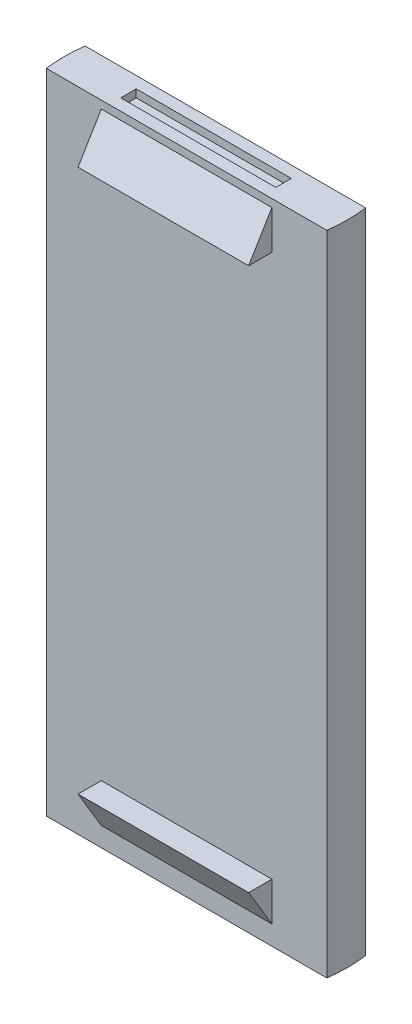
ISO-10303-21;
HEADER;
FILE_DESCRIPTION(('STEP AP214'),'2;1');
FILE_NAME('part.step','',(''),(''),'','','');
FILE_SCHEMA(('AUTOMOTIVE_DESIGN { 1 0 10303 214 1 1 1 1 }'));
ENDSEC;
DATA;
#1=APPLICATION_CONTEXT('core data for automotive mechanical design processes');
#2=APPLICATION_PROTOCOL_DEFINITION('international standard','automotive_design',2000,#1);
#3=PRODUCT_CONTEXT('',#1,'mechanical');
#4=PRODUCT('Part','Part','',(#3));
#5=PRODUCT_RELATED_PRODUCT_CATEGORY('part','',(#4));
#6=PRODUCT_DEFINITION_FORMATION('','',#4);
#7=PRODUCT_DEFINITION_CONTEXT('part definition',#1,'design');
#8=PRODUCT_DEFINITION('design','',#6,#7);
#9=PRODUCT_DEFINITION_SHAPE('','',#8);
#10=(LENGTH_UNIT() NAMED_UNIT(*) SI_UNIT(.MILLI.,.METRE.));
#11=(NAMED_UNIT(*) PLANE_ANGLE_UNIT() SI_UNIT($,.RADIAN.));
#12=(NAMED_UNIT(*) SI_UNIT($,.STERADIAN.) SOLID_ANGLE_UNIT());
#13=UNCERTAINTY_MEASURE_WITH_UNIT(LENGTH_MEASURE(1.E-05),#10,'distance_accuracy_value','');
#14=(GEOMETRIC_REPRESENTATION_CONTEXT(3) GLOBAL_UNCERTAINTY_ASSIGNED_CONTEXT((#13)) GLOBAL_UNIT_ASSIGNED_CONTEXT((#10,
#11,#12)) REPRESENTATION_CONTEXT('',''));
#15=CARTESIAN_POINT('',(0.,0.,0.));
#16=DIRECTION('',(0.,0.,1.));
#17=DIRECTION('',(1.,0.,0.));
#18=AXIS2_PLACEMENT_3D('',#15,#16,#17);
#19=CARTESIAN_POINT('',(0.,0.,12.7));
#20=DIRECTION('',(0.,0.,1.));
#21=DIRECTION('',(1.,0.,0.));
#22=AXIS2_PLACEMENT_3D('',#19,#20,#21);
#23=PLANE('',#22);
#24=DIRECTION('',(-1.,0.,0.));
#25=VECTOR('',#24,1.);
#26=CARTESIAN_POINT('',(0.,-31.75,12.7));
#27=LINE('',#26,#25);
#28=CARTESIAN_POINT('',(45.918008722069,-31.75,12.7));
#29=VERTEX_POINT('',#28);
#30=CARTESIAN_POINT('',(-45.9180087220689,-31.75,12.7));
#31=VERTEX_POINT('',#30);
#32=EDGE_CURVE('E141',#29,#31,#27,.T.);
#33=ORIENTED_EDGE('',*,*,#32,.F.);
#34=DIRECTION('',(0.,1.,0.));
#35=VECTOR('',#34,1.);
#36=CARTESIAN_POINT('',(45.918008722069,-180.34,12.7));
#37=LINE('',#36,#35);
#38=CARTESIAN_POINT('',(45.918008722069,180.34,12.7));
#39=VERTEX_POINT('',#38);
#40=EDGE_CURVE('E148',#29,#39,#37,.T.);
#41=ORIENTED_EDGE('',*,*,#40,.T.);
#42=DIRECTION('',(-1.,0.,0.));
#43=VECTOR('',#42,1.);
#44=CARTESIAN_POINT('',(49.53,180.34,12.7));
#45=LINE('',#44,#43);
#46=CARTESIAN_POINT('',(-45.9180087220689,180.34,12.7));
#47=VERTEX_POINT('',#46);
#48=EDGE_CURVE('E246',#39,#47,#45,.T.);
#49=ORIENTED_EDGE('',*,*,#48,.T.);
#50=DIRECTION('',(0.,1.,0.));
#51=VECTOR('',#50,1.);
#52=CARTESIAN_POINT('',(-45.9180087220689,-180.34,12.7));
#53=LINE('',#52,#51);
#54=EDGE_CURVE('E63',#47,#31,#53,.F.);
#55=ORIENTED_EDGE('',*,*,#54,.T.);
#56=EDGE_LOOP('',(#33,#41,#49,#55));
#57=FACE_BOUND('',#56,.T.);
#58=DIRECTION('',(0.,-1.,0.));
#59=VECTOR('',#58,1.);
#60=CARTESIAN_POINT('',(-27.94,0.,12.7));
#61=LINE('',#60,#59);
#62=CARTESIAN_POINT('',(-27.94,177.8,12.7));
#63=VERTEX_POINT('',#62);
#64=CARTESIAN_POINT('',(-27.94,165.1,12.7));
#65=VERTEX_POINT('',#64);
#66=EDGE_CURVE('E249',#63,#65,#61,.T.);
#67=ORIENTED_EDGE('',*,*,#66,.F.);
#68=DIRECTION('',(1.,0.,0.));
#69=VECTOR('',#68,1.);
#70=CARTESIAN_POINT('',(0.,177.8,12.7));
#71=LINE('',#70,#69);
#72=CARTESIAN_POINT('',(27.94,177.8,12.7));
#73=VERTEX_POINT('',#72);
#74=EDGE_CURVE('E256',#63,#73,#71,.T.);
#75=ORIENTED_EDGE('',*,*,#74,.T.);
#76=DIRECTION('',(0.,-1.,0.));
#77=VECTOR('',#76,1.);
#78=CARTESIAN_POINT('',(27.94,0.,12.7));
#79=LINE('',#78,#77);
#80=CARTESIAN_POINT('',(27.94,165.1,12.7));
#81=VERTEX_POINT('',#80);
#82=EDGE_CURVE('E260',#73,#81,#79,.T.);
#83=ORIENTED_EDGE('',*,*,#82,.T.);
#84=DIRECTION('',(1.,0.,0.));
#85=VECTOR('',#84,1.);
#86=CARTESIAN_POINT('',(0.,165.1,12.7));
#87=LINE('',#86,#85);
#88=EDGE_CURVE('E263',#65,#81,#87,.T.);
#89=ORIENTED_EDGE('',*,*,#88,.F.);
#90=EDGE_LOOP('',(#67,#75,#83,#89));
#91=FACE_BOUND('',#90,.T.);
#92=DIRECTION('',(1.,0.,0.));
#93=VECTOR('',#92,1.);
#94=CARTESIAN_POINT('',(0.,-25.4,12.7));
#95=LINE('',#94,#93);
#96=CARTESIAN_POINT('',(-27.94,-25.4,12.7));
#97=VERTEX_POINT('',#96);
#98=CARTESIAN_POINT('',(27.94,-25.4,12.7));
#99=VERTEX_POINT('',#98);
#100=EDGE_CURVE('E267',#97,#99,#95,.T.);
#101=ORIENTED_EDGE('',*,*,#100,.F.);
#102=DIRECTION('',(0.,-1.,0.));
#103=VECTOR('',#102,1.);
#104=CARTESIAN_POINT('',(-27.94,0.,12.7));
#105=LINE('',#104,#103);
#106=CARTESIAN_POINT('',(-27.94,-12.7,12.7));
#107=VERTEX_POINT('',#106);
#108=EDGE_CURVE('E270',#107,#97,#105,.T.);
#109=ORIENTED_EDGE('',*,*,#108,.F.);
#110=DIRECTION('',(1.,0.,0.));
#111=VECTOR('',#110,1.);
#112=CARTESIAN_POINT('',(0.,-12.7,12.7));
#113=LINE('',#112,#111);
#114=CARTESIAN_POINT('',(27.94,-12.7,12.7));
#115=VERTEX_POINT('',#114);
#116=EDGE_CURVE('E274',#107,#115,#113,.T.);
#117=ORIENTED_EDGE('',*,*,#116,.T.);
#118=DIRECTION('',(0.,-1.,0.));
#119=VECTOR('',#118,1.);
#120=CARTESIAN_POINT('',(27.94,0.,12.7));
#121=LINE('',#120,#119);
#122=EDGE_CURVE('E277',#115,#99,#121,.T.);
#123=ORIENTED_EDGE('',*,*,#122,.T.);
#124=EDGE_LOOP('',(#101,#109,#117,#123));
#125=FACE_BOUND('',#124,.T.);
#126=ADVANCED_FACE('F40',(#57,#91,#125),#23,.T.);
#127=CARTESIAN_POINT('',(0.,0.,0.));
#128=DIRECTION('',(0.,0.,1.));
#129=DIRECTION('',(1.,0.,0.));
#130=AXIS2_PLACEMENT_3D('',#127,#128,#129);
#131=PLANE('',#130);
#132=DIRECTION('',(0.,1.,0.));
#133=VECTOR('',#132,1.);
#134=CARTESIAN_POINT('',(45.918008722069,-180.34,0.));
#135=LINE('',#134,#133);
#136=CARTESIAN_POINT('',(45.918008722069,-31.75,0.));
#137=VERTEX_POINT('',#136);
#138=CARTESIAN_POINT('',(45.918008722069,180.34,0.));
#139=VERTEX_POINT('',#138);
#140=EDGE_CURVE('E164',#137,#139,#135,.T.);
#141=ORIENTED_EDGE('',*,*,#140,.F.);
#142=DIRECTION('',(-1.,0.,0.));
#143=VECTOR('',#142,1.);
#144=CARTESIAN_POINT('',(0.,-31.75,0.));
#145=LINE('',#144,#143);
#146=CARTESIAN_POINT('',(-45.9180087220689,-31.75,0.));
#147=VERTEX_POINT('',#146);
#148=EDGE_CURVE('E55',#137,#147,#145,.T.);
#149=ORIENTED_EDGE('',*,*,#148,.T.);
#150=DIRECTION('',(0.,1.,0.));
#151=VECTOR('',#150,1.);
#152=CARTESIAN_POINT('',(-45.9180087220689,-180.34,0.));
#153=LINE('',#152,#151);
#154=CARTESIAN_POINT('',(-45.9180087220689,180.34,0.));
#155=VERTEX_POINT('',#154);
#156=EDGE_CURVE('E284',#155,#147,#153,.F.);
#157=ORIENTED_EDGE('',*,*,#156,.F.);
#158=DIRECTION('',(-1.,0.,0.));
#159=VECTOR('',#158,1.);
#160=CARTESIAN_POINT('',(49.53,180.34,0.));
#161=LINE('',#160,#159);
#162=EDGE_CURVE('E245',#139,#155,#161,.T.);
#163=ORIENTED_EDGE('',*,*,#162,.F.);
#164=EDGE_LOOP('',(#141,#149,#157,#163));
#165=FACE_BOUND('',#164,.T.);
#166=ADVANCED_FACE('F288',(#165),#131,.F.);
#167=CARTESIAN_POINT('',(49.53,180.34,12.7));
#168=DIRECTION('',(0.,-1.,0.));
#169=DIRECTION('',(0.,0.,-1.));
#170=AXIS2_PLACEMENT_3D('',#167,#168,#169);
#171=PLANE('',#170);
#172=DIRECTION('',(1.,0.,0.));
#173=VECTOR('',#172,1.);
#174=CARTESIAN_POINT('',(25.4,180.34,8.88999999999999));
#175=LINE('',#174,#173);
#176=CARTESIAN_POINT('',(-25.4,180.34,8.89));
#177=VERTEX_POINT('',#176);
#178=CARTESIAN_POINT('',(25.4,180.34,8.88999999999999));
#179=VERTEX_POINT('',#178);
#180=EDGE_CURVE('E162',#177,#179,#175,.T.);
#181=ORIENTED_EDGE('',*,*,#180,.F.);
#182=DIRECTION('',(0.,0.,1.));
#183=VECTOR('',#182,1.);
#184=CARTESIAN_POINT('',(-25.4,180.34,8.89));
#185=LINE('',#184,#183);
#186=CARTESIAN_POINT('',(-25.4,180.34,3.81));
#187=VERTEX_POINT('',#186);
#188=EDGE_CURVE('E158',#187,#177,#185,.T.);
#189=ORIENTED_EDGE('',*,*,#188,.F.);
#190=DIRECTION('',(-1.,0.,0.));
#191=VECTOR('',#190,1.);
#192=CARTESIAN_POINT('',(25.4,180.34,3.80999999999999));
#193=LINE('',#192,#191);
#194=CARTESIAN_POINT('',(25.4,180.34,3.80999999999999));
#195=VERTEX_POINT('',#194);
#196=EDGE_CURVE('E173',#195,#187,#193,.T.);
#197=ORIENTED_EDGE('',*,*,#196,.F.);
#198=DIRECTION('',(0.,0.,-1.));
#199=VECTOR('',#198,1.);
#200=CARTESIAN_POINT('',(25.4,180.34,8.88999999999999));
#201=LINE('',#200,#199);
#202=EDGE_CURVE('E189',#179,#195,#201,.T.);
#203=ORIENTED_EDGE('',*,*,#202,.F.);
#204=EDGE_LOOP('',(#181,#189,#197,#203));
#205=FACE_BOUND('',#204,.T.);
#206=CARTESIAN_POINT('',(0.,180.34,6.35));
#207=DIRECTION('',(0.,1.,0.));
#208=DIRECTION('',(0.,0.,1.));
#209=AXIS2_PLACEMENT_3D('',#206,#207,#208);
#210=CIRCLE('',#209,46.355);
#211=EDGE_CURVE('E155',#39,#139,#210,.T.);
#212=ORIENTED_EDGE('',*,*,#211,.T.);
#213=ORIENTED_EDGE('',*,*,#162,.T.);
#214=CARTESIAN_POINT('',(0.,180.34,6.35));
#215=DIRECTION('',(0.,-1.,0.));
#216=DIRECTION('',(0.,0.,-1.));
#217=AXIS2_PLACEMENT_3D('',#214,#215,#216);
#218=CIRCLE('',#217,46.355);
#219=EDGE_CURVE('E49',#47,#155,#218,.T.);
#220=ORIENTED_EDGE('',*,*,#219,.F.);
#221=ORIENTED_EDGE('',*,*,#48,.F.);
#222=EDGE_LOOP('',(#212,#213,#220,#221));
#223=FACE_BOUND('',#222,.T.);
#224=ADVANCED_FACE('F42',(#205,#223),#171,.F.);
#225=CARTESIAN_POINT('',(0.,165.1,20.32));
#226=DIRECTION('',(0.,-1.,0.));
#227=DIRECTION('',(0.,0.,-1.));
#228=AXIS2_PLACEMENT_3D('',#225,#226,#227);
#229=PLANE('',#228);
#230=DIRECTION('',(0.,0.,-1.));
#231=VECTOR('',#230,1.);
#232=CARTESIAN_POINT('',(-27.94,165.1,20.32));
#233=LINE('',#232,#231);
#234=CARTESIAN_POINT('',(-27.94,165.1,20.32));
#235=VERTEX_POINT('',#234);
#236=EDGE_CURVE('E237',#235,#65,#233,.T.);
#237=ORIENTED_EDGE('',*,*,#236,.T.);
#238=ORIENTED_EDGE('',*,*,#88,.T.);
#239=DIRECTION('',(0.,0.,-1.));
#240=VECTOR('',#239,1.);
#241=CARTESIAN_POINT('',(27.94,165.1,20.32));
#242=LINE('',#241,#240);
#243=CARTESIAN_POINT('',(27.94,165.1,20.32));
#244=VERTEX_POINT('',#243);
#245=EDGE_CURVE('E241',#244,#81,#242,.T.);
#246=ORIENTED_EDGE('',*,*,#245,.F.);
#247=DIRECTION('',(-1.,0.,0.));
#248=VECTOR('',#247,1.);
#249=CARTESIAN_POINT('',(0.,165.1,20.32));
#250=LINE('',#249,#248);
#251=EDGE_CURVE('E233',#244,#235,#250,.T.);
#252=ORIENTED_EDGE('',*,*,#251,.T.);
#253=EDGE_LOOP('',(#237,#238,#246,#252));
#254=FACE_BOUND('',#253,.T.);
#255=ADVANCED_FACE('F299',(#254),#229,.T.);
#256=CARTESIAN_POINT('',(27.94,0.,20.32));
#257=DIRECTION('',(-1.,0.,0.));
#258=DIRECTION('',(0.,0.,1.));
#259=AXIS2_PLACEMENT_3D('',#256,#257,#258);
#260=PLANE('',#259);
#261=ORIENTED_EDGE('',*,*,#82,.F.);
#262=DIRECTION('',(0.,-0.857492925712544,0.514495755427527));
#263=VECTOR('',#262,1.);
#264=CARTESIAN_POINT('',(27.94,43.7029411764706,93.1582352941177));
#265=LINE('',#264,#263);
#266=EDGE_CURVE('E218',#73,#244,#265,.T.);
#267=ORIENTED_EDGE('',*,*,#266,.T.);
#268=ORIENTED_EDGE('',*,*,#245,.T.);
#269=EDGE_LOOP('',(#261,#267,#268));
#270=FACE_BOUND('',#269,.T.);
#271=ADVANCED_FACE('F305',(#270),#260,.F.);
#272=CARTESIAN_POINT('',(-27.94,0.,20.32));
#273=DIRECTION('',(-1.,0.,0.));
#274=DIRECTION('',(0.,0.,1.));
#275=AXIS2_PLACEMENT_3D('',#272,#273,#274);
#276=PLANE('',#275);
#277=DIRECTION('',(0.,-0.857492925712544,0.514495755427527));
#278=VECTOR('',#277,1.);
#279=CARTESIAN_POINT('',(-27.94,43.7029411764706,93.1582352941177));
#280=LINE('',#279,#278);
#281=EDGE_CURVE('E215',#63,#235,#280,.T.);
#282=ORIENTED_EDGE('',*,*,#281,.F.);
#283=ORIENTED_EDGE('',*,*,#66,.T.);
#284=ORIENTED_EDGE('',*,*,#236,.F.);
#285=EDGE_LOOP('',(#282,#283,#284));
#286=FACE_BOUND('',#285,.T.);
#287=ADVANCED_FACE('F316',(#286),#276,.T.);
#288=CARTESIAN_POINT('',(27.94,0.,20.32));
#289=DIRECTION('',(-1.,0.,0.));
#290=DIRECTION('',(0.,0.,1.));
#291=AXIS2_PLACEMENT_3D('',#288,#289,#290);
#292=PLANE('',#291);
#293=DIRECTION('',(0.,0.,-1.));
#294=VECTOR('',#293,1.);
#295=CARTESIAN_POINT('',(27.94,-12.7,20.32));
#296=LINE('',#295,#294);
#297=CARTESIAN_POINT('',(27.94,-12.7,20.32));
#298=VERTEX_POINT('',#297);
#299=EDGE_CURVE('E229',#298,#115,#296,.T.);
#300=ORIENTED_EDGE('',*,*,#299,.F.);
#301=DIRECTION('',(0.,-0.857492925712544,-0.514495755427527));
#302=VECTOR('',#301,1.);
#303=CARTESIAN_POINT('',(27.94,-3.36176470588236,25.9229411764706));
#304=LINE('',#303,#302);
#305=EDGE_CURVE('E211',#298,#99,#304,.T.);
#306=ORIENTED_EDGE('',*,*,#305,.T.);
#307=ORIENTED_EDGE('',*,*,#122,.F.);
#308=EDGE_LOOP('',(#300,#306,#307));
#309=FACE_BOUND('',#308,.T.);
#310=ADVANCED_FACE('F320',(#309),#292,.F.);
#311=CARTESIAN_POINT('',(0.,-12.7,20.32));
#312=DIRECTION('',(0.,-1.,0.));
#313=DIRECTION('',(0.,0.,-1.));
#314=AXIS2_PLACEMENT_3D('',#311,#312,#313);
#315=PLANE('',#314);
#316=ORIENTED_EDGE('',*,*,#116,.F.);
#317=DIRECTION('',(0.,0.,-1.));
#318=VECTOR('',#317,1.);
#319=CARTESIAN_POINT('',(-27.94,-12.7,20.32));
#320=LINE('',#319,#318);
#321=CARTESIAN_POINT('',(-27.94,-12.7,20.32));
#322=VERTEX_POINT('',#321);
#323=EDGE_CURVE('E225',#322,#107,#320,.T.);
#324=ORIENTED_EDGE('',*,*,#323,.F.);
#325=DIRECTION('',(-1.,0.,0.));
#326=VECTOR('',#325,1.);
#327=CARTESIAN_POINT('',(0.,-12.7,20.32));
#328=LINE('',#327,#326);
#329=EDGE_CURVE('E222',#298,#322,#328,.T.);
#330=ORIENTED_EDGE('',*,*,#329,.F.);
#331=ORIENTED_EDGE('',*,*,#299,.T.);
#332=EDGE_LOOP('',(#316,#324,#330,#331));
#333=FACE_BOUND('',#332,.T.);
#334=ADVANCED_FACE('F324',(#333),#315,.F.);
#335=CARTESIAN_POINT('',(-27.94,0.,20.32));
#336=DIRECTION('',(-1.,0.,0.));
#337=DIRECTION('',(0.,0.,1.));
#338=AXIS2_PLACEMENT_3D('',#335,#336,#337);
#339=PLANE('',#338);
#340=DIRECTION('',(0.,-0.857492925712544,-0.514495755427527));
#341=VECTOR('',#340,1.);
#342=CARTESIAN_POINT('',(-27.94,-3.36176470588236,25.9229411764706));
#343=LINE('',#342,#341);
#344=EDGE_CURVE('E199',#322,#97,#343,.T.);
#345=ORIENTED_EDGE('',*,*,#344,.F.);
#346=ORIENTED_EDGE('',*,*,#323,.T.);
#347=ORIENTED_EDGE('',*,*,#108,.T.);
#348=EDGE_LOOP('',(#345,#346,#347));
#349=FACE_BOUND('',#348,.T.);
#350=ADVANCED_FACE('F328',(#349),#339,.T.);
#351=CARTESIAN_POINT('',(-38.1,-12.7,20.32));
#352=DIRECTION('',(0.,0.514495755427527,-0.857492925712544));
#353=DIRECTION('',(0.,0.857492925712544,0.514495755427527));
#354=AXIS2_PLACEMENT_3D('',#351,#352,#353);
#355=PLANE('',#354);
#356=ORIENTED_EDGE('',*,*,#329,.T.);
#357=ORIENTED_EDGE('',*,*,#344,.T.);
#358=ORIENTED_EDGE('',*,*,#100,.T.);
#359=ORIENTED_EDGE('',*,*,#305,.F.);
#360=EDGE_LOOP('',(#356,#357,#358,#359));
#361=FACE_BOUND('',#360,.T.);
#362=ADVANCED_FACE('F332',(#361),#355,.F.);
#363=CARTESIAN_POINT('',(-38.1,177.8,12.7));
#364=DIRECTION('',(0.,-0.514495755427527,-0.857492925712544));
#365=DIRECTION('',(0.,0.857492925712544,-0.514495755427527));
#366=AXIS2_PLACEMENT_3D('',#363,#364,#365);
#367=PLANE('',#366);
#368=ORIENTED_EDGE('',*,*,#74,.F.);
#369=ORIENTED_EDGE('',*,*,#281,.T.);
#370=ORIENTED_EDGE('',*,*,#251,.F.);
#371=ORIENTED_EDGE('',*,*,#266,.F.);
#372=EDGE_LOOP('',(#368,#369,#370,#371));
#373=FACE_BOUND('',#372,.T.);
#374=ADVANCED_FACE('F334',(#373),#367,.F.);
#375=CARTESIAN_POINT('',(-25.4,177.8,8.89));
#376=DIRECTION('',(-1.,0.,0.));
#377=DIRECTION('',(0.,0.,1.));
#378=AXIS2_PLACEMENT_3D('',#375,#376,#377);
#379=PLANE('',#378);
#380=ORIENTED_EDGE('',*,*,#188,.T.);
#381=DIRECTION('',(0.,1.,0.));
#382=VECTOR('',#381,1.);
#383=CARTESIAN_POINT('',(-25.4,177.8,8.89));
#384=LINE('',#383,#382);
#385=CARTESIAN_POINT('',(-25.4,177.8,8.89));
#386=VERTEX_POINT('',#385);
#387=EDGE_CURVE('E184',#386,#177,#384,.T.);
#388=ORIENTED_EDGE('',*,*,#387,.F.);
#389=DIRECTION('',(0.,0.,1.));
#390=VECTOR('',#389,1.);
#391=CARTESIAN_POINT('',(-25.4,177.8,8.89));
#392=LINE('',#391,#390);
#393=CARTESIAN_POINT('',(-25.4,177.8,3.81));
#394=VERTEX_POINT('',#393);
#395=EDGE_CURVE('E168',#394,#386,#392,.T.);
#396=ORIENTED_EDGE('',*,*,#395,.F.);
#397=DIRECTION('',(0.,1.,0.));
#398=VECTOR('',#397,1.);
#399=CARTESIAN_POINT('',(-25.4,177.8,3.81));
#400=LINE('',#399,#398);
#401=EDGE_CURVE('E196',#394,#187,#400,.T.);
#402=ORIENTED_EDGE('',*,*,#401,.T.);
#403=EDGE_LOOP('',(#380,#388,#396,#402));
#404=FACE_BOUND('',#403,.T.);
#405=ADVANCED_FACE('F337',(#404),#379,.F.);
#406=CARTESIAN_POINT('',(25.4,177.8,3.80999999999999));
#407=DIRECTION('',(0.,0.,-1.));
#408=DIRECTION('',(-1.,0.,0.));
#409=AXIS2_PLACEMENT_3D('',#406,#407,#408);
#410=PLANE('',#409);
#411=ORIENTED_EDGE('',*,*,#196,.T.);
#412=ORIENTED_EDGE('',*,*,#401,.F.);
#413=DIRECTION('',(-1.,0.,0.));
#414=VECTOR('',#413,1.);
#415=CARTESIAN_POINT('',(25.4,177.8,3.80999999999999));
#416=LINE('',#415,#414);
#417=CARTESIAN_POINT('',(25.4,177.8,3.80999999999999));
#418=VERTEX_POINT('',#417);
#419=EDGE_CURVE('E181',#418,#394,#416,.T.);
#420=ORIENTED_EDGE('',*,*,#419,.F.);
#421=DIRECTION('',(0.,1.,0.));
#422=VECTOR('',#421,1.);
#423=CARTESIAN_POINT('',(25.4,177.8,3.80999999999999));
#424=LINE('',#423,#422);
#425=EDGE_CURVE('E200',#418,#195,#424,.T.);
#426=ORIENTED_EDGE('',*,*,#425,.T.);
#427=EDGE_LOOP('',(#411,#412,#420,#426));
#428=FACE_BOUND('',#427,.T.);
#429=ADVANCED_FACE('F344',(#428),#410,.F.);
#430=CARTESIAN_POINT('',(25.4,177.8,8.88999999999999));
#431=DIRECTION('',(1.,0.,0.));
#432=DIRECTION('',(0.,0.,-1.));
#433=AXIS2_PLACEMENT_3D('',#430,#431,#432);
#434=PLANE('',#433);
#435=ORIENTED_EDGE('',*,*,#202,.T.);
#436=ORIENTED_EDGE('',*,*,#425,.F.);
#437=DIRECTION('',(0.,0.,-1.));
#438=VECTOR('',#437,1.);
#439=CARTESIAN_POINT('',(25.4,177.8,8.88999999999999));
#440=LINE('',#439,#438);
#441=CARTESIAN_POINT('',(25.4,177.8,8.88999999999999));
#442=VERTEX_POINT('',#441);
#443=EDGE_CURVE('E177',#442,#418,#440,.T.);
#444=ORIENTED_EDGE('',*,*,#443,.F.);
#445=DIRECTION('',(0.,1.,0.));
#446=VECTOR('',#445,1.);
#447=CARTESIAN_POINT('',(25.4,177.8,8.88999999999999));
#448=LINE('',#447,#446);
#449=EDGE_CURVE('E203',#442,#179,#448,.T.);
#450=ORIENTED_EDGE('',*,*,#449,.T.);
#451=EDGE_LOOP('',(#435,#436,#444,#450));
#452=FACE_BOUND('',#451,.T.);
#453=ADVANCED_FACE('F350',(#452),#434,.F.);
#454=CARTESIAN_POINT('',(25.4,177.8,8.88999999999999));
#455=DIRECTION('',(0.,0.,1.));
#456=DIRECTION('',(1.,0.,0.));
#457=AXIS2_PLACEMENT_3D('',#454,#455,#456);
#458=PLANE('',#457);
#459=ORIENTED_EDGE('',*,*,#180,.T.);
#460=ORIENTED_EDGE('',*,*,#449,.F.);
#461=DIRECTION('',(1.,0.,0.));
#462=VECTOR('',#461,1.);
#463=CARTESIAN_POINT('',(25.4,177.8,8.88999999999999));
#464=LINE('',#463,#462);
#465=EDGE_CURVE('E172',#386,#442,#464,.T.);
#466=ORIENTED_EDGE('',*,*,#465,.F.);
#467=ORIENTED_EDGE('',*,*,#387,.T.);
#468=EDGE_LOOP('',(#459,#460,#466,#467));
#469=FACE_BOUND('',#468,.T.);
#470=ADVANCED_FACE('F346',(#469),#458,.F.);
#471=CARTESIAN_POINT('',(0.,177.8,0.));
#472=DIRECTION('',(0.,1.,0.));
#473=DIRECTION('',(0.,0.,1.));
#474=AXIS2_PLACEMENT_3D('',#471,#472,#473);
#475=PLANE('',#474);
#476=ORIENTED_EDGE('',*,*,#395,.T.);
#477=ORIENTED_EDGE('',*,*,#465,.T.);
#478=ORIENTED_EDGE('',*,*,#443,.T.);
#479=ORIENTED_EDGE('',*,*,#419,.T.);
#480=EDGE_LOOP('',(#476,#477,#478,#479));
#481=FACE_BOUND('',#480,.T.);
#482=ADVANCED_FACE('F349',(#481),#475,.T.);
#483=CARTESIAN_POINT('',(0.,-180.34,6.35));
#484=DIRECTION('',(0.,1.,0.));
#485=DIRECTION('',(0.,0.,1.));
#486=AXIS2_PLACEMENT_3D('',#483,#484,#485);
#487=CYLINDRICAL_SURFACE('',#486,46.355);
#488=CARTESIAN_POINT('',(0.,-31.75,6.35));
#489=DIRECTION('',(0.,1.,0.));
#490=DIRECTION('',(-1.,0.,0.));
#491=AXIS2_PLACEMENT_3D('',#488,#489,#490);
#492=CIRCLE('',#491,46.355);
#493=EDGE_CURVE('E151',#31,#147,#492,.F.);
#494=ORIENTED_EDGE('',*,*,#493,.F.);
#495=ORIENTED_EDGE('',*,*,#54,.F.);
#496=ORIENTED_EDGE('',*,*,#219,.T.);
#497=ORIENTED_EDGE('',*,*,#156,.T.);
#498=EDGE_LOOP('',(#494,#495,#496,#497));
#499=FACE_BOUND('',#498,.T.);
#500=ADVANCED_FACE('F283',(#499),#487,.T.);
#501=CARTESIAN_POINT('',(0.,-31.75,6.35));
#502=DIRECTION('',(0.,1.,0.));
#503=DIRECTION('',(-1.,0.,0.));
#504=AXIS2_PLACEMENT_3D('',#501,#502,#503);
#505=CIRCLE('',#504,46.355);
#506=EDGE_CURVE('E11',#137,#29,#505,.F.);
#507=ORIENTED_EDGE('',*,*,#506,.F.);
#508=ORIENTED_EDGE('',*,*,#140,.T.);
#509=ORIENTED_EDGE('',*,*,#211,.F.);
#510=ORIENTED_EDGE('',*,*,#40,.F.);
#511=EDGE_LOOP('',(#507,#508,#509,#510));
#512=FACE_BOUND('',#511,.T.);
#513=ADVANCED_FACE('F153',(#512),#487,.T.);
#514=CARTESIAN_POINT('',(79.3289697207933,-31.75,-20.32));
#515=DIRECTION('',(0.,1.,0.));
#516=DIRECTION('',(-1.,0.,0.));
#517=AXIS2_PLACEMENT_3D('',#514,#515,#516);
#518=PLANE('',#517);
#519=ORIENTED_EDGE('',*,*,#493,.T.);
#520=ORIENTED_EDGE('',*,*,#148,.F.);
#521=ORIENTED_EDGE('',*,*,#506,.T.);
#522=ORIENTED_EDGE('',*,*,#32,.T.);
#523=EDGE_LOOP('',(#519,#520,#521,#522));
#524=FACE_BOUND('',#523,.T.);
#525=ADVANCED_FACE('F140',(#524),#518,.F.);
#526=CLOSED_SHELL('',(#126,#166,#224,#255,#271,#287,#310,#334,#350,#362,#374,#405,#429,#453,
#470,#482,#500,#513,#525));
#527=MANIFOLD_SOLID_BREP('B2',#526);
#528=ADVANCED_BREP_SHAPE_REPRESENTATION('',(#18,#527),#14);
#529=SHAPE_DEFINITION_REPRESENTATION(#9,#528);
ENDSEC;
END-ISO-10303-21;
